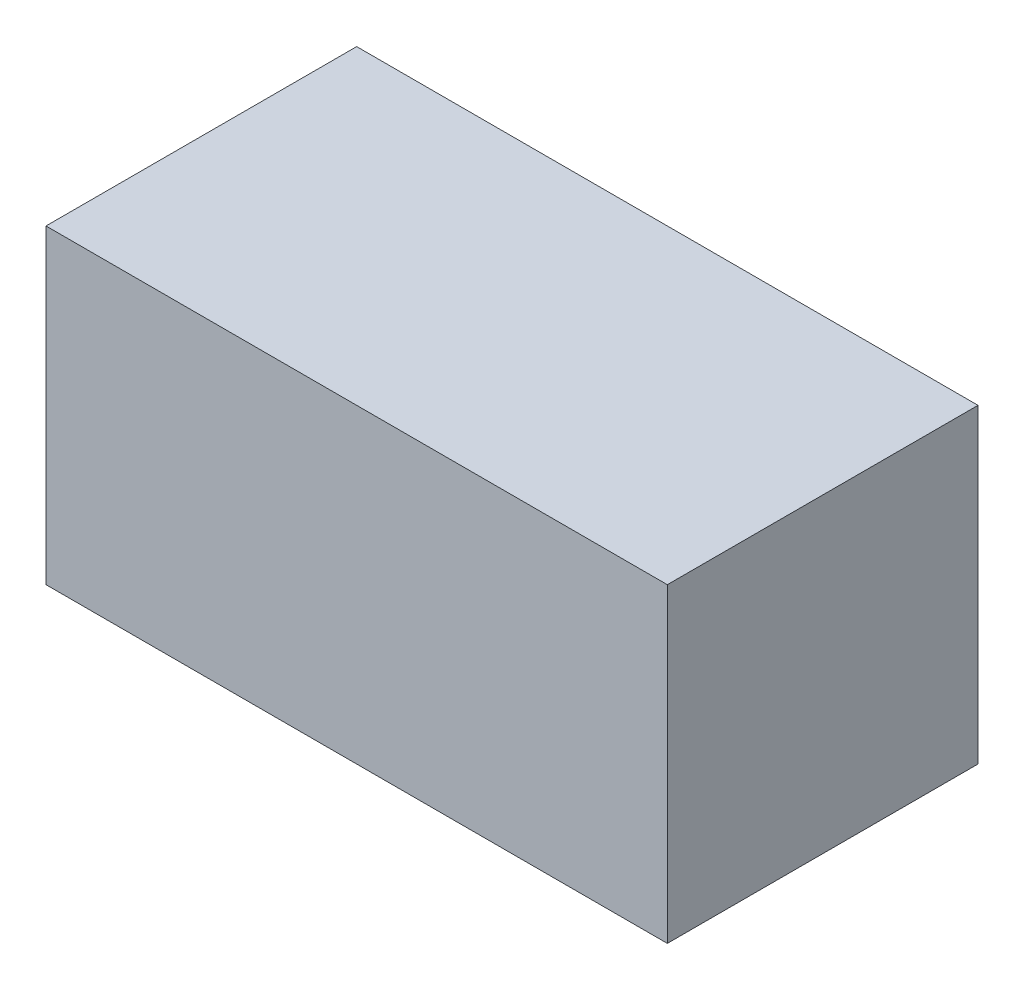
ISO-10303-21;
HEADER;
FILE_DESCRIPTION(('STEP AP214'),'2;1');
FILE_NAME('part.step','',(''),(''),'','','');
FILE_SCHEMA(('AUTOMOTIVE_DESIGN { 1 0 10303 214 1 1 1 1 }'));
ENDSEC;
DATA;
#1=APPLICATION_CONTEXT('core data for automotive mechanical design processes');
#2=APPLICATION_PROTOCOL_DEFINITION('international standard','automotive_design',2000,#1);
#3=PRODUCT_CONTEXT('',#1,'mechanical');
#4=PRODUCT('Part','Part','',(#3));
#5=PRODUCT_RELATED_PRODUCT_CATEGORY('part','',(#4));
#6=PRODUCT_DEFINITION_FORMATION('','',#4);
#7=PRODUCT_DEFINITION_CONTEXT('part definition',#1,'design');
#8=PRODUCT_DEFINITION('design','',#6,#7);
#9=PRODUCT_DEFINITION_SHAPE('','',#8);
#10=(LENGTH_UNIT() NAMED_UNIT(*) SI_UNIT(.MILLI.,.METRE.));
#11=(NAMED_UNIT(*) PLANE_ANGLE_UNIT() SI_UNIT($,.RADIAN.));
#12=(NAMED_UNIT(*) SI_UNIT($,.STERADIAN.) SOLID_ANGLE_UNIT());
#13=UNCERTAINTY_MEASURE_WITH_UNIT(LENGTH_MEASURE(1.E-05),#10,'distance_accuracy_value','');
#14=(GEOMETRIC_REPRESENTATION_CONTEXT(3) GLOBAL_UNCERTAINTY_ASSIGNED_CONTEXT((#13)) GLOBAL_UNIT_ASSIGNED_CONTEXT((#10,
#11,#12)) REPRESENTATION_CONTEXT('',''));
#15=CARTESIAN_POINT('',(0.,0.,0.));
#16=DIRECTION('',(0.,0.,1.));
#17=DIRECTION('',(1.,0.,0.));
#18=AXIS2_PLACEMENT_3D('',#15,#16,#17);
#19=CARTESIAN_POINT('',(0.,0.,-10.));
#20=DIRECTION('',(-1.,0.,0.));
#21=DIRECTION('',(0.,0.,1.));
#22=AXIS2_PLACEMENT_3D('',#19,#20,#21);
#23=PLANE('',#22);
#24=DIRECTION('',(0.,-1.,0.));
#25=VECTOR('',#24,1.);
#26=CARTESIAN_POINT('',(0.,0.,0.));
#27=LINE('',#26,#25);
#28=CARTESIAN_POINT('',(0.,10.,0.));
#29=VERTEX_POINT('',#28);
#30=CARTESIAN_POINT('',(0.,0.,0.));
#31=VERTEX_POINT('',#30);
#32=EDGE_CURVE('E97',#29,#31,#27,.T.);
#33=ORIENTED_EDGE('',*,*,#32,.F.);
#34=DIRECTION('',(0.,0.,1.));
#35=VECTOR('',#34,1.);
#36=CARTESIAN_POINT('',(0.,10.,-10.));
#37=LINE('',#36,#35);
#38=CARTESIAN_POINT('',(0.,10.,-10.));
#39=VERTEX_POINT('',#38);
#40=EDGE_CURVE('E11',#39,#29,#37,.T.);
#41=ORIENTED_EDGE('',*,*,#40,.F.);
#42=DIRECTION('',(0.,-1.,0.));
#43=VECTOR('',#42,1.);
#44=CARTESIAN_POINT('',(0.,0.,-10.));
#45=LINE('',#44,#43);
#46=CARTESIAN_POINT('',(0.,0.,-10.));
#47=VERTEX_POINT('',#46);
#48=EDGE_CURVE('E91',#39,#47,#45,.T.);
#49=ORIENTED_EDGE('',*,*,#48,.T.);
#50=DIRECTION('',(0.,0.,1.));
#51=VECTOR('',#50,1.);
#52=CARTESIAN_POINT('',(0.,0.,-10.));
#53=LINE('',#52,#51);
#54=EDGE_CURVE('E36',#47,#31,#53,.T.);
#55=ORIENTED_EDGE('',*,*,#54,.T.);
#56=EDGE_LOOP('',(#33,#41,#49,#55));
#57=FACE_BOUND('',#56,.T.);
#58=ADVANCED_FACE('F33',(#57),#23,.T.);
#59=CARTESIAN_POINT('',(0.,10.,-10.));
#60=DIRECTION('',(0.,1.,0.));
#61=DIRECTION('',(0.,0.,1.));
#62=AXIS2_PLACEMENT_3D('',#59,#60,#61);
#63=PLANE('',#62);
#64=DIRECTION('',(-1.,0.,0.));
#65=VECTOR('',#64,1.);
#66=CARTESIAN_POINT('',(0.,10.,0.));
#67=LINE('',#66,#65);
#68=CARTESIAN_POINT('',(20.,10.,0.));
#69=VERTEX_POINT('',#68);
#70=EDGE_CURVE('E93',#69,#29,#67,.T.);
#71=ORIENTED_EDGE('',*,*,#70,.F.);
#72=DIRECTION('',(0.,0.,1.));
#73=VECTOR('',#72,1.);
#74=CARTESIAN_POINT('',(20.,10.,-10.));
#75=LINE('',#74,#73);
#76=CARTESIAN_POINT('',(20.,10.,-10.));
#77=VERTEX_POINT('',#76);
#78=EDGE_CURVE('E42',#77,#69,#75,.T.);
#79=ORIENTED_EDGE('',*,*,#78,.F.);
#80=DIRECTION('',(-1.,0.,0.));
#81=VECTOR('',#80,1.);
#82=CARTESIAN_POINT('',(0.,10.,-10.));
#83=LINE('',#82,#81);
#84=EDGE_CURVE('E88',#77,#39,#83,.T.);
#85=ORIENTED_EDGE('',*,*,#84,.T.);
#86=ORIENTED_EDGE('',*,*,#40,.T.);
#87=EDGE_LOOP('',(#71,#79,#85,#86));
#88=FACE_BOUND('',#87,.T.);
#89=ADVANCED_FACE('F107',(#88),#63,.T.);
#90=CARTESIAN_POINT('',(20.,0.,-10.));
#91=DIRECTION('',(1.,0.,0.));
#92=DIRECTION('',(0.,0.,-1.));
#93=AXIS2_PLACEMENT_3D('',#90,#91,#92);
#94=PLANE('',#93);
#95=DIRECTION('',(0.,1.,0.));
#96=VECTOR('',#95,1.);
#97=CARTESIAN_POINT('',(20.,0.,0.));
#98=LINE('',#97,#96);
#99=CARTESIAN_POINT('',(20.,0.,0.));
#100=VERTEX_POINT('',#99);
#101=EDGE_CURVE('E83',#100,#69,#98,.T.);
#102=ORIENTED_EDGE('',*,*,#101,.F.);
#103=DIRECTION('',(0.,0.,1.));
#104=VECTOR('',#103,1.);
#105=CARTESIAN_POINT('',(20.,0.,-10.));
#106=LINE('',#105,#104);
#107=CARTESIAN_POINT('',(20.,0.,-10.));
#108=VERTEX_POINT('',#107);
#109=EDGE_CURVE('E78',#108,#100,#106,.T.);
#110=ORIENTED_EDGE('',*,*,#109,.F.);
#111=DIRECTION('',(0.,1.,0.));
#112=VECTOR('',#111,1.);
#113=CARTESIAN_POINT('',(20.,0.,-10.));
#114=LINE('',#113,#112);
#115=EDGE_CURVE('E81',#108,#77,#114,.T.);
#116=ORIENTED_EDGE('',*,*,#115,.T.);
#117=ORIENTED_EDGE('',*,*,#78,.T.);
#118=EDGE_LOOP('',(#102,#110,#116,#117));
#119=FACE_BOUND('',#118,.T.);
#120=ADVANCED_FACE('F80',(#119),#94,.T.);
#121=CARTESIAN_POINT('',(0.,0.,-10.));
#122=DIRECTION('',(0.,-1.,0.));
#123=DIRECTION('',(0.,0.,-1.));
#124=AXIS2_PLACEMENT_3D('',#121,#122,#123);
#125=PLANE('',#124);
#126=DIRECTION('',(1.,0.,0.));
#127=VECTOR('',#126,1.);
#128=CARTESIAN_POINT('',(0.,0.,0.));
#129=LINE('',#128,#127);
#130=EDGE_CURVE('E100',#31,#100,#129,.T.);
#131=ORIENTED_EDGE('',*,*,#130,.F.);
#132=ORIENTED_EDGE('',*,*,#54,.F.);
#133=DIRECTION('',(1.,0.,0.));
#134=VECTOR('',#133,1.);
#135=CARTESIAN_POINT('',(0.,0.,-10.));
#136=LINE('',#135,#134);
#137=EDGE_CURVE('E87',#47,#108,#136,.T.);
#138=ORIENTED_EDGE('',*,*,#137,.T.);
#139=ORIENTED_EDGE('',*,*,#109,.T.);
#140=EDGE_LOOP('',(#131,#132,#138,#139));
#141=FACE_BOUND('',#140,.T.);
#142=ADVANCED_FACE('F90',(#141),#125,.T.);
#143=CARTESIAN_POINT('',(0.,0.,-10.));
#144=DIRECTION('',(0.,0.,-1.));
#145=DIRECTION('',(-1.,0.,0.));
#146=AXIS2_PLACEMENT_3D('',#143,#144,#145);
#147=PLANE('',#146);
#148=ORIENTED_EDGE('',*,*,#48,.F.);
#149=ORIENTED_EDGE('',*,*,#84,.F.);
#150=ORIENTED_EDGE('',*,*,#115,.F.);
#151=ORIENTED_EDGE('',*,*,#137,.F.);
#152=EDGE_LOOP('',(#148,#149,#150,#151));
#153=FACE_BOUND('',#152,.T.);
#154=ADVANCED_FACE('F86',(#153),#147,.T.);
#155=CARTESIAN_POINT('',(0.,0.,0.));
#156=DIRECTION('',(0.,0.,-1.));
#157=DIRECTION('',(-1.,0.,0.));
#158=AXIS2_PLACEMENT_3D('',#155,#156,#157);
#159=PLANE('',#158);
#160=ORIENTED_EDGE('',*,*,#32,.T.);
#161=ORIENTED_EDGE('',*,*,#130,.T.);
#162=ORIENTED_EDGE('',*,*,#101,.T.);
#163=ORIENTED_EDGE('',*,*,#70,.T.);
#164=EDGE_LOOP('',(#160,#161,#162,#163));
#165=FACE_BOUND('',#164,.T.);
#166=ADVANCED_FACE('F106',(#165),#159,.F.);
#167=CLOSED_SHELL('',(#58,#89,#120,#142,#154,#166));
#168=MANIFOLD_SOLID_BREP('B2',#167);
#169=ADVANCED_BREP_SHAPE_REPRESENTATION('',(#18,#168),#14);
#170=SHAPE_DEFINITION_REPRESENTATION(#9,#169);
ENDSEC;
END-ISO-10303-21;
